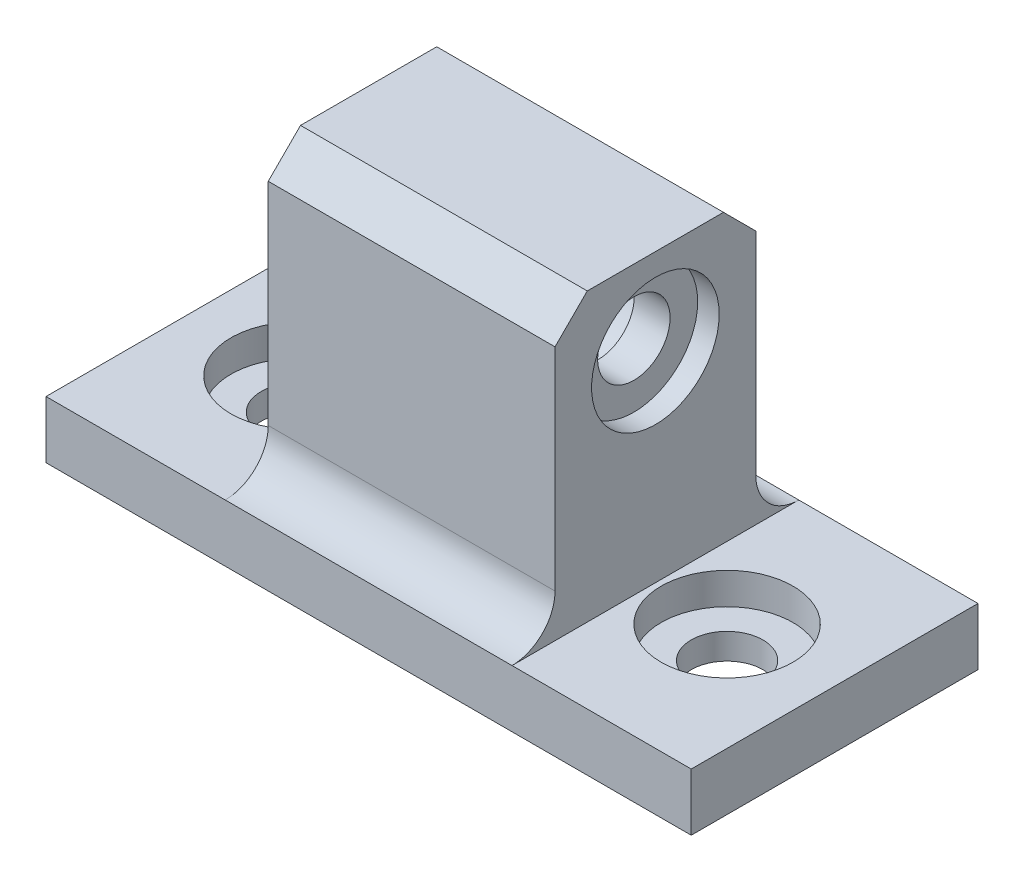
ISO-10303-21;
HEADER;
FILE_DESCRIPTION(('STEP AP214'),'2;1');
FILE_NAME('part.step','',(''),(''),'','','');
FILE_SCHEMA(('AUTOMOTIVE_DESIGN { 1 0 10303 214 1 1 1 1 }'));
ENDSEC;
DATA;
#1=APPLICATION_CONTEXT('core data for automotive mechanical design processes');
#2=APPLICATION_PROTOCOL_DEFINITION('international standard','automotive_design',2000,#1);
#3=PRODUCT_CONTEXT('',#1,'mechanical');
#4=PRODUCT('Part','Part','',(#3));
#5=PRODUCT_RELATED_PRODUCT_CATEGORY('part','',(#4));
#6=PRODUCT_DEFINITION_FORMATION('','',#4);
#7=PRODUCT_DEFINITION_CONTEXT('part definition',#1,'design');
#8=PRODUCT_DEFINITION('design','',#6,#7);
#9=PRODUCT_DEFINITION_SHAPE('','',#8);
#10=(LENGTH_UNIT() NAMED_UNIT(*) SI_UNIT(.MILLI.,.METRE.));
#11=(NAMED_UNIT(*) PLANE_ANGLE_UNIT() SI_UNIT($,.RADIAN.));
#12=(NAMED_UNIT(*) SI_UNIT($,.STERADIAN.) SOLID_ANGLE_UNIT());
#13=UNCERTAINTY_MEASURE_WITH_UNIT(LENGTH_MEASURE(1.E-05),#10,'distance_accuracy_value','');
#14=(GEOMETRIC_REPRESENTATION_CONTEXT(3) GLOBAL_UNCERTAINTY_ASSIGNED_CONTEXT((#13)) GLOBAL_UNIT_ASSIGNED_CONTEXT((#10,
#11,#12)) REPRESENTATION_CONTEXT('',''));
#15=CARTESIAN_POINT('',(0.,0.,0.));
#16=DIRECTION('',(0.,0.,1.));
#17=DIRECTION('',(1.,0.,0.));
#18=AXIS2_PLACEMENT_3D('',#15,#16,#17);
#19=CARTESIAN_POINT('',(0.,4.,0.));
#20=DIRECTION('',(0.,1.,0.));
#21=DIRECTION('',(0.,0.,1.));
#22=AXIS2_PLACEMENT_3D('',#19,#20,#21);
#23=PLANE('',#22);
#24=CARTESIAN_POINT('',(15.,4.,0.));
#25=DIRECTION('',(0.,1.,0.));
#26=DIRECTION('',(0.,0.,1.));
#27=AXIS2_PLACEMENT_3D('',#24,#25,#26);
#28=CIRCLE('',#27,4.6);
#29=CARTESIAN_POINT('',(15.,4.,4.6));
#30=VERTEX_POINT('',#29);
#31=EDGE_CURVE('E291',#30,#30,#28,.T.);
#32=ORIENTED_EDGE('',*,*,#31,.F.);
#33=EDGE_LOOP('',(#32));
#34=FACE_BOUND('',#33,.T.);
#35=DIRECTION('',(1.,0.,0.));
#36=VECTOR('',#35,1.);
#37=CARTESIAN_POINT('',(0.,4.,-10.));
#38=LINE('',#37,#36);
#39=CARTESIAN_POINT('',(10.,4.,-10.));
#40=VERTEX_POINT('',#39);
#41=CARTESIAN_POINT('',(22.5,4.,-10.));
#42=VERTEX_POINT('',#41);
#43=EDGE_CURVE('E158',#40,#42,#38,.T.);
#44=ORIENTED_EDGE('',*,*,#43,.F.);
#45=DIRECTION('',(0.,0.,-1.));
#46=VECTOR('',#45,1.);
#47=CARTESIAN_POINT('',(10.,4.,0.));
#48=LINE('',#47,#46);
#49=CARTESIAN_POINT('',(10.,4.,10.));
#50=VERTEX_POINT('',#49);
#51=EDGE_CURVE('E141',#50,#40,#48,.T.);
#52=ORIENTED_EDGE('',*,*,#51,.F.);
#53=DIRECTION('',(1.,0.,0.));
#54=VECTOR('',#53,1.);
#55=CARTESIAN_POINT('',(0.,4.,10.));
#56=LINE('',#55,#54);
#57=CARTESIAN_POINT('',(22.5,4.,10.));
#58=VERTEX_POINT('',#57);
#59=EDGE_CURVE('E136',#50,#58,#56,.T.);
#60=ORIENTED_EDGE('',*,*,#59,.T.);
#61=DIRECTION('',(0.,0.,-1.));
#62=VECTOR('',#61,1.);
#63=CARTESIAN_POINT('',(22.5,4.,0.));
#64=LINE('',#63,#62);
#65=EDGE_CURVE('E139',#58,#42,#64,.T.);
#66=ORIENTED_EDGE('',*,*,#65,.T.);
#67=EDGE_LOOP('',(#44,#52,#60,#66));
#68=FACE_BOUND('',#67,.T.);
#69=ADVANCED_FACE('F44',(#34,#68),#23,.T.);
#70=CARTESIAN_POINT('',(-1.14177848998413,18.,0.));
#71=DIRECTION('',(1.,0.,0.));
#72=DIRECTION('',(0.,0.,-1.));
#73=AXIS2_PLACEMENT_3D('',#70,#71,#72);
#74=CYLINDRICAL_SURFACE('',#73,2.525);
#75=CARTESIAN_POINT('',(6.,18.,0.));
#76=DIRECTION('',(-1.,0.,0.));
#77=DIRECTION('',(0.,0.,1.));
#78=AXIS2_PLACEMENT_3D('',#75,#76,#77);
#79=CIRCLE('',#78,2.525);
#80=CARTESIAN_POINT('',(6.,18.,2.525));
#81=VERTEX_POINT('',#80);
#82=EDGE_CURVE('E350',#81,#81,#79,.F.);
#83=ORIENTED_EDGE('',*,*,#82,.F.);
#84=EDGE_LOOP('',(#83));
#85=FACE_BOUND('',#84,.T.);
#86=CARTESIAN_POINT('',(8.5,18.,0.));
#87=DIRECTION('',(1.,0.,0.));
#88=DIRECTION('',(0.,0.,-1.));
#89=AXIS2_PLACEMENT_3D('',#86,#87,#88);
#90=CIRCLE('',#89,2.525);
#91=CARTESIAN_POINT('',(8.5,18.,-2.525));
#92=VERTEX_POINT('',#91);
#93=EDGE_CURVE('E358',#92,#92,#90,.T.);
#94=ORIENTED_EDGE('',*,*,#93,.T.);
#95=EDGE_LOOP('',(#94));
#96=FACE_BOUND('',#95,.T.);
#97=ADVANCED_FACE('F323',(#85,#96),#74,.F.);
#98=CARTESIAN_POINT('',(-15.,4.,0.));
#99=DIRECTION('',(0.,-1.,0.));
#100=DIRECTION('',(0.,0.,-1.));
#101=AXIS2_PLACEMENT_3D('',#98,#99,#100);
#102=CYLINDRICAL_SURFACE('',#101,2.5);
#103=CARTESIAN_POINT('',(-15.,0.,0.));
#104=DIRECTION('',(0.,1.,0.));
#105=DIRECTION('',(0.,0.,1.));
#106=AXIS2_PLACEMENT_3D('',#103,#104,#105);
#107=CIRCLE('',#106,2.5);
#108=CARTESIAN_POINT('',(-15.,0.,2.49999999999999));
#109=VERTEX_POINT('',#108);
#110=EDGE_CURVE('E251',#109,#109,#107,.F.);
#111=ORIENTED_EDGE('',*,*,#110,.T.);
#112=EDGE_LOOP('',(#111));
#113=FACE_BOUND('',#112,.T.);
#114=CARTESIAN_POINT('',(-15.,1.8,0.));
#115=DIRECTION('',(0.,1.,0.));
#116=DIRECTION('',(0.,0.,1.));
#117=AXIS2_PLACEMENT_3D('',#114,#115,#116);
#118=CIRCLE('',#117,2.5);
#119=CARTESIAN_POINT('',(-15.,1.8,2.49999999999999));
#120=VERTEX_POINT('',#119);
#121=EDGE_CURVE('E175',#120,#120,#118,.F.);
#122=ORIENTED_EDGE('',*,*,#121,.F.);
#123=EDGE_LOOP('',(#122));
#124=FACE_BOUND('',#123,.T.);
#125=ADVANCED_FACE('F277',(#113,#124),#102,.F.);
#126=CARTESIAN_POINT('',(15.,4.,0.));
#127=DIRECTION('',(0.,-1.,0.));
#128=DIRECTION('',(0.,0.,-1.));
#129=AXIS2_PLACEMENT_3D('',#126,#127,#128);
#130=CYLINDRICAL_SURFACE('',#129,2.5);
#131=CARTESIAN_POINT('',(15.,0.,0.));
#132=DIRECTION('',(0.,1.,0.));
#133=DIRECTION('',(0.,0.,1.));
#134=AXIS2_PLACEMENT_3D('',#131,#132,#133);
#135=CIRCLE('',#134,2.5);
#136=CARTESIAN_POINT('',(15.,0.,2.5));
#137=VERTEX_POINT('',#136);
#138=EDGE_CURVE('E148',#137,#137,#135,.T.);
#139=ORIENTED_EDGE('',*,*,#138,.F.);
#140=EDGE_LOOP('',(#139));
#141=FACE_BOUND('',#140,.T.);
#142=CARTESIAN_POINT('',(15.,1.8,0.));
#143=DIRECTION('',(0.,1.,0.));
#144=DIRECTION('',(0.,0.,1.));
#145=AXIS2_PLACEMENT_3D('',#142,#143,#144);
#146=CIRCLE('',#145,2.5);
#147=CARTESIAN_POINT('',(15.,1.8,2.5));
#148=VERTEX_POINT('',#147);
#149=EDGE_CURVE('E172',#148,#148,#146,.T.);
#150=ORIENTED_EDGE('',*,*,#149,.T.);
#151=EDGE_LOOP('',(#150));
#152=FACE_BOUND('',#151,.T.);
#153=ADVANCED_FACE('F274',(#141,#152),#130,.F.);
#154=CARTESIAN_POINT('',(0.,4.,10.));
#155=DIRECTION('',(0.,0.,-1.));
#156=DIRECTION('',(-1.,0.,0.));
#157=AXIS2_PLACEMENT_3D('',#154,#155,#156);
#158=PLANE('',#157);
#159=DIRECTION('',(1.,0.,0.));
#160=VECTOR('',#159,1.);
#161=CARTESIAN_POINT('',(0.,0.,10.));
#162=LINE('',#161,#160);
#163=CARTESIAN_POINT('',(-22.5,0.,10.));
#164=VERTEX_POINT('',#163);
#165=CARTESIAN_POINT('',(22.5,0.,10.));
#166=VERTEX_POINT('',#165);
#167=EDGE_CURVE('E162',#164,#166,#162,.T.);
#168=ORIENTED_EDGE('',*,*,#167,.T.);
#169=DIRECTION('',(0.,-1.,0.));
#170=VECTOR('',#169,1.);
#171=CARTESIAN_POINT('',(22.5,4.,10.));
#172=LINE('',#171,#170);
#173=EDGE_CURVE('E155',#58,#166,#172,.T.);
#174=ORIENTED_EDGE('',*,*,#173,.F.);
#175=ORIENTED_EDGE('',*,*,#59,.F.);
#176=CARTESIAN_POINT('',(-10.,4.,10.));
#177=VERTEX_POINT('',#176);
#178=EDGE_CURVE('E147',#177,#50,#56,.T.);
#179=ORIENTED_EDGE('',*,*,#178,.F.);
#180=CARTESIAN_POINT('',(-22.5,4.,10.));
#181=VERTEX_POINT('',#180);
#182=EDGE_CURVE('E150',#181,#177,#56,.T.);
#183=ORIENTED_EDGE('',*,*,#182,.F.);
#184=DIRECTION('',(0.,-1.,0.));
#185=VECTOR('',#184,1.);
#186=CARTESIAN_POINT('',(-22.5,4.,10.));
#187=LINE('',#186,#185);
#188=EDGE_CURVE('E241',#181,#164,#187,.T.);
#189=ORIENTED_EDGE('',*,*,#188,.T.);
#190=EDGE_LOOP('',(#168,#174,#175,#179,#183,#189));
#191=FACE_BOUND('',#190,.T.);
#192=ADVANCED_FACE('F160',(#191),#158,.F.);
#193=CARTESIAN_POINT('',(22.5,4.,0.));
#194=DIRECTION('',(-1.,0.,0.));
#195=DIRECTION('',(0.,0.,1.));
#196=AXIS2_PLACEMENT_3D('',#193,#194,#195);
#197=PLANE('',#196);
#198=DIRECTION('',(0.,0.,-1.));
#199=VECTOR('',#198,1.);
#200=CARTESIAN_POINT('',(22.5,0.,0.));
#201=LINE('',#200,#199);
#202=CARTESIAN_POINT('',(22.5,0.,-10.));
#203=VERTEX_POINT('',#202);
#204=EDGE_CURVE('E243',#166,#203,#201,.T.);
#205=ORIENTED_EDGE('',*,*,#204,.T.);
#206=DIRECTION('',(0.,-1.,0.));
#207=VECTOR('',#206,1.);
#208=CARTESIAN_POINT('',(22.5,4.,-10.));
#209=LINE('',#208,#207);
#210=EDGE_CURVE('E157',#42,#203,#209,.T.);
#211=ORIENTED_EDGE('',*,*,#210,.F.);
#212=ORIENTED_EDGE('',*,*,#65,.F.);
#213=ORIENTED_EDGE('',*,*,#173,.T.);
#214=EDGE_LOOP('',(#205,#211,#212,#213));
#215=FACE_BOUND('',#214,.T.);
#216=ADVANCED_FACE('F154',(#215),#197,.F.);
#217=CARTESIAN_POINT('',(0.,4.,-10.));
#218=DIRECTION('',(0.,0.,-1.));
#219=DIRECTION('',(-1.,0.,0.));
#220=AXIS2_PLACEMENT_3D('',#217,#218,#219);
#221=PLANE('',#220);
#222=DIRECTION('',(1.,0.,0.));
#223=VECTOR('',#222,1.);
#224=CARTESIAN_POINT('',(0.,0.,-10.));
#225=LINE('',#224,#223);
#226=CARTESIAN_POINT('',(-22.5,0.,-10.));
#227=VERTEX_POINT('',#226);
#228=EDGE_CURVE('E245',#227,#203,#225,.T.);
#229=ORIENTED_EDGE('',*,*,#228,.F.);
#230=DIRECTION('',(0.,-1.,0.));
#231=VECTOR('',#230,1.);
#232=CARTESIAN_POINT('',(-22.5,4.,-10.));
#233=LINE('',#232,#231);
#234=CARTESIAN_POINT('',(-22.5,4.,-10.));
#235=VERTEX_POINT('',#234);
#236=EDGE_CURVE('E168',#235,#227,#233,.T.);
#237=ORIENTED_EDGE('',*,*,#236,.F.);
#238=CARTESIAN_POINT('',(-10.,4.,-10.));
#239=VERTEX_POINT('',#238);
#240=EDGE_CURVE('E234',#235,#239,#38,.T.);
#241=ORIENTED_EDGE('',*,*,#240,.T.);
#242=EDGE_CURVE('E238',#239,#40,#38,.T.);
#243=ORIENTED_EDGE('',*,*,#242,.T.);
#244=ORIENTED_EDGE('',*,*,#43,.T.);
#245=ORIENTED_EDGE('',*,*,#210,.T.);
#246=EDGE_LOOP('',(#229,#237,#241,#243,#244,#245));
#247=FACE_BOUND('',#246,.T.);
#248=ADVANCED_FACE('F263',(#247),#221,.T.);
#249=CARTESIAN_POINT('',(-22.5,4.,0.));
#250=DIRECTION('',(-1.,0.,0.));
#251=DIRECTION('',(0.,0.,1.));
#252=AXIS2_PLACEMENT_3D('',#249,#250,#251);
#253=PLANE('',#252);
#254=DIRECTION('',(0.,0.,-1.));
#255=VECTOR('',#254,1.);
#256=CARTESIAN_POINT('',(-22.5,0.,0.));
#257=LINE('',#256,#255);
#258=EDGE_CURVE('E248',#164,#227,#257,.T.);
#259=ORIENTED_EDGE('',*,*,#258,.F.);
#260=ORIENTED_EDGE('',*,*,#188,.F.);
#261=DIRECTION('',(0.,0.,-1.));
#262=VECTOR('',#261,1.);
#263=CARTESIAN_POINT('',(-22.5,4.,0.));
#264=LINE('',#263,#262);
#265=EDGE_CURVE('E237',#181,#235,#264,.T.);
#266=ORIENTED_EDGE('',*,*,#265,.T.);
#267=ORIENTED_EDGE('',*,*,#236,.T.);
#268=EDGE_LOOP('',(#259,#260,#266,#267));
#269=FACE_BOUND('',#268,.T.);
#270=ADVANCED_FACE('F259',(#269),#253,.T.);
#271=CARTESIAN_POINT('',(-15.,4.,0.));
#272=DIRECTION('',(0.,1.,0.));
#273=DIRECTION('',(0.,0.,1.));
#274=AXIS2_PLACEMENT_3D('',#271,#272,#273);
#275=CIRCLE('',#274,4.6);
#276=CARTESIAN_POINT('',(-15.,4.,4.59999999999999));
#277=VERTEX_POINT('',#276);
#278=EDGE_CURVE('E295',#277,#277,#275,.T.);
#279=ORIENTED_EDGE('',*,*,#278,.F.);
#280=EDGE_LOOP('',(#279));
#281=FACE_BOUND('',#280,.T.);
#282=DIRECTION('',(0.,0.,-1.));
#283=VECTOR('',#282,1.);
#284=CARTESIAN_POINT('',(-10.,4.,0.));
#285=LINE('',#284,#283);
#286=EDGE_CURVE('E227',#177,#239,#285,.T.);
#287=ORIENTED_EDGE('',*,*,#286,.T.);
#288=ORIENTED_EDGE('',*,*,#240,.F.);
#289=ORIENTED_EDGE('',*,*,#265,.F.);
#290=ORIENTED_EDGE('',*,*,#182,.T.);
#291=EDGE_LOOP('',(#287,#288,#289,#290));
#292=FACE_BOUND('',#291,.T.);
#293=ADVANCED_FACE('F268',(#281,#292),#23,.T.);
#294=CARTESIAN_POINT('',(0.,0.,0.));
#295=DIRECTION('',(0.,1.,0.));
#296=DIRECTION('',(0.,0.,1.));
#297=AXIS2_PLACEMENT_3D('',#294,#295,#296);
#298=PLANE('',#297);
#299=ORIENTED_EDGE('',*,*,#167,.F.);
#300=ORIENTED_EDGE('',*,*,#258,.T.);
#301=ORIENTED_EDGE('',*,*,#228,.T.);
#302=ORIENTED_EDGE('',*,*,#204,.F.);
#303=EDGE_LOOP('',(#299,#300,#301,#302));
#304=FACE_BOUND('',#303,.T.);
#305=ORIENTED_EDGE('',*,*,#110,.F.);
#306=EDGE_LOOP('',(#305));
#307=FACE_BOUND('',#306,.T.);
#308=ORIENTED_EDGE('',*,*,#138,.T.);
#309=EDGE_LOOP('',(#308));
#310=FACE_BOUND('',#309,.T.);
#311=ADVANCED_FACE('F265',(#304,#307,#310),#298,.F.);
#312=CARTESIAN_POINT('',(10.,24.,0.));
#313=DIRECTION('',(-1.,0.,0.));
#314=DIRECTION('',(0.,0.,1.));
#315=AXIS2_PLACEMENT_3D('',#312,#313,#314);
#316=PLANE('',#315);
#317=CARTESIAN_POINT('',(10.,18.,0.));
#318=DIRECTION('',(1.,0.,0.));
#319=DIRECTION('',(0.,0.,-1.));
#320=AXIS2_PLACEMENT_3D('',#317,#318,#319);
#321=CIRCLE('',#320,4.45);
#322=CARTESIAN_POINT('',(10.,18.,-4.45));
#323=VERTEX_POINT('',#322);
#324=EDGE_CURVE('E355',#323,#323,#321,.T.);
#325=ORIENTED_EDGE('',*,*,#324,.F.);
#326=EDGE_LOOP('',(#325));
#327=FACE_BOUND('',#326,.T.);
#328=DIRECTION('',(0.,0.,-1.));
#329=VECTOR('',#328,1.);
#330=CARTESIAN_POINT('',(10.,24.,0.));
#331=LINE('',#330,#329);
#332=CARTESIAN_POINT('',(10.,24.,4.75000000000001));
#333=VERTEX_POINT('',#332);
#334=CARTESIAN_POINT('',(10.,24.,-4.75000000000001));
#335=VERTEX_POINT('',#334);
#336=EDGE_CURVE('E215',#333,#335,#331,.T.);
#337=ORIENTED_EDGE('',*,*,#336,.F.);
#338=DIRECTION('',(0.,0.707106781186549,-0.707106781186546));
#339=VECTOR('',#338,1.);
#340=CARTESIAN_POINT('',(10.,24.,4.75));
#341=LINE('',#340,#339);
#342=CARTESIAN_POINT('',(10.,21.75,7.));
#343=VERTEX_POINT('',#342);
#344=EDGE_CURVE('E199',#333,#343,#341,.F.);
#345=ORIENTED_EDGE('',*,*,#344,.T.);
#346=DIRECTION('',(0.,-1.,0.));
#347=VECTOR('',#346,1.);
#348=CARTESIAN_POINT('',(10.,24.,7.));
#349=LINE('',#348,#347);
#350=CARTESIAN_POINT('',(10.,7.,7.));
#351=VERTEX_POINT('',#350);
#352=EDGE_CURVE('E214',#343,#351,#349,.T.);
#353=ORIENTED_EDGE('',*,*,#352,.T.);
#354=CARTESIAN_POINT('',(10.,7.,10.));
#355=DIRECTION('',(-1.,0.,0.));
#356=DIRECTION('',(0.,0.,1.));
#357=AXIS2_PLACEMENT_3D('',#354,#355,#356);
#358=CIRCLE('',#357,3.);
#359=EDGE_CURVE('E187',#351,#50,#358,.T.);
#360=ORIENTED_EDGE('',*,*,#359,.T.);
#361=ORIENTED_EDGE('',*,*,#51,.T.);
#362=CARTESIAN_POINT('',(10.,7.,-10.));
#363=DIRECTION('',(-1.,0.,0.));
#364=DIRECTION('',(0.,0.,1.));
#365=AXIS2_PLACEMENT_3D('',#362,#363,#364);
#366=CIRCLE('',#365,3.);
#367=CARTESIAN_POINT('',(10.,7.,-7.));
#368=VERTEX_POINT('',#367);
#369=EDGE_CURVE('E181',#40,#368,#366,.T.);
#370=ORIENTED_EDGE('',*,*,#369,.T.);
#371=DIRECTION('',(0.,-1.,0.));
#372=VECTOR('',#371,1.);
#373=CARTESIAN_POINT('',(10.,24.,-7.));
#374=LINE('',#373,#372);
#375=CARTESIAN_POINT('',(10.,21.75,-7.));
#376=VERTEX_POINT('',#375);
#377=EDGE_CURVE('E231',#376,#368,#374,.T.);
#378=ORIENTED_EDGE('',*,*,#377,.F.);
#379=DIRECTION('',(0.,0.707106781186546,0.707106781186549));
#380=VECTOR('',#379,1.);
#381=CARTESIAN_POINT('',(10.,21.75,-7.));
#382=LINE('',#381,#380);
#383=EDGE_CURVE('E197',#376,#335,#382,.T.);
#384=ORIENTED_EDGE('',*,*,#383,.T.);
#385=EDGE_LOOP('',(#337,#345,#353,#360,#361,#370,#378,#384));
#386=FACE_BOUND('',#385,.T.);
#387=ADVANCED_FACE('F219',(#327,#386),#316,.F.);
#388=CARTESIAN_POINT('',(0.,24.,-7.));
#389=DIRECTION('',(0.,0.,-1.));
#390=DIRECTION('',(-1.,0.,0.));
#391=AXIS2_PLACEMENT_3D('',#388,#389,#390);
#392=PLANE('',#391);
#393=DIRECTION('',(0.,-1.,0.));
#394=VECTOR('',#393,1.);
#395=CARTESIAN_POINT('',(-10.,24.,-7.));
#396=LINE('',#395,#394);
#397=CARTESIAN_POINT('',(-10.,21.75,-7.));
#398=VERTEX_POINT('',#397);
#399=CARTESIAN_POINT('',(-10.,7.,-7.));
#400=VERTEX_POINT('',#399);
#401=EDGE_CURVE('E224',#398,#400,#396,.T.);
#402=ORIENTED_EDGE('',*,*,#401,.F.);
#403=DIRECTION('',(1.,0.,0.));
#404=VECTOR('',#403,1.);
#405=CARTESIAN_POINT('',(10.,21.75,-7.));
#406=LINE('',#405,#404);
#407=EDGE_CURVE('E11',#398,#376,#406,.T.);
#408=ORIENTED_EDGE('',*,*,#407,.T.);
#409=ORIENTED_EDGE('',*,*,#377,.T.);
#410=DIRECTION('',(1.,0.,0.));
#411=VECTOR('',#410,1.);
#412=CARTESIAN_POINT('',(-10.,7.,-7.));
#413=LINE('',#412,#411);
#414=EDGE_CURVE('E163',#368,#400,#413,.F.);
#415=ORIENTED_EDGE('',*,*,#414,.T.);
#416=EDGE_LOOP('',(#402,#408,#409,#415));
#417=FACE_BOUND('',#416,.T.);
#418=ADVANCED_FACE('F314',(#417),#392,.T.);
#419=CARTESIAN_POINT('',(-10.,24.,0.));
#420=DIRECTION('',(-1.,0.,0.));
#421=DIRECTION('',(0.,0.,1.));
#422=AXIS2_PLACEMENT_3D('',#419,#420,#421);
#423=PLANE('',#422);
#424=CARTESIAN_POINT('',(-10.,18.,0.));
#425=DIRECTION('',(-1.,0.,0.));
#426=DIRECTION('',(0.,0.,1.));
#427=AXIS2_PLACEMENT_3D('',#424,#425,#426);
#428=CIRCLE('',#427,4.6);
#429=CARTESIAN_POINT('',(-10.,18.,4.6));
#430=VERTEX_POINT('',#429);
#431=EDGE_CURVE('E298',#430,#430,#428,.T.);
#432=ORIENTED_EDGE('',*,*,#431,.F.);
#433=EDGE_LOOP('',(#432));
#434=FACE_BOUND('',#433,.T.);
#435=DIRECTION('',(0.,-1.,0.));
#436=VECTOR('',#435,1.);
#437=CARTESIAN_POINT('',(-10.,24.,6.99999999999999));
#438=LINE('',#437,#436);
#439=CARTESIAN_POINT('',(-10.,21.75,6.99999999999999));
#440=VERTEX_POINT('',#439);
#441=CARTESIAN_POINT('',(-10.,7.,6.99999999999999));
#442=VERTEX_POINT('',#441);
#443=EDGE_CURVE('E206',#440,#442,#438,.T.);
#444=ORIENTED_EDGE('',*,*,#443,.F.);
#445=DIRECTION('',(0.,-0.707106781186549,0.707106781186546));
#446=VECTOR('',#445,1.);
#447=CARTESIAN_POINT('',(-10.,26.375,2.375));
#448=LINE('',#447,#446);
#449=CARTESIAN_POINT('',(-10.,24.,4.74999999999999));
#450=VERTEX_POINT('',#449);
#451=EDGE_CURVE('E53',#440,#450,#448,.F.);
#452=ORIENTED_EDGE('',*,*,#451,.T.);
#453=DIRECTION('',(0.,0.,-1.));
#454=VECTOR('',#453,1.);
#455=CARTESIAN_POINT('',(-10.,24.,0.));
#456=LINE('',#455,#454);
#457=CARTESIAN_POINT('',(-10.,24.,-4.75000000000001));
#458=VERTEX_POINT('',#457);
#459=EDGE_CURVE('E205',#450,#458,#456,.T.);
#460=ORIENTED_EDGE('',*,*,#459,.T.);
#461=DIRECTION('',(0.,-0.707106781186546,-0.707106781186549));
#462=VECTOR('',#461,1.);
#463=CARTESIAN_POINT('',(-10.,26.375,-2.375));
#464=LINE('',#463,#462);
#465=EDGE_CURVE('E60',#458,#398,#464,.T.);
#466=ORIENTED_EDGE('',*,*,#465,.T.);
#467=ORIENTED_EDGE('',*,*,#401,.T.);
#468=CARTESIAN_POINT('',(-10.,7.,-10.));
#469=DIRECTION('',(-1.,0.,0.));
#470=DIRECTION('',(0.,0.,1.));
#471=AXIS2_PLACEMENT_3D('',#468,#469,#470);
#472=CIRCLE('',#471,3.);
#473=EDGE_CURVE('E184',#400,#239,#472,.F.);
#474=ORIENTED_EDGE('',*,*,#473,.T.);
#475=ORIENTED_EDGE('',*,*,#286,.F.);
#476=CARTESIAN_POINT('',(-10.,7.,9.99999999999999));
#477=DIRECTION('',(-1.,0.,0.));
#478=DIRECTION('',(0.,0.,1.));
#479=AXIS2_PLACEMENT_3D('',#476,#477,#478);
#480=CIRCLE('',#479,3.);
#481=EDGE_CURVE('E189',#177,#442,#480,.F.);
#482=ORIENTED_EDGE('',*,*,#481,.T.);
#483=EDGE_LOOP('',(#444,#452,#460,#466,#467,#474,#475,#482));
#484=FACE_BOUND('',#483,.T.);
#485=ADVANCED_FACE('F204',(#434,#484),#423,.T.);
#486=CARTESIAN_POINT('',(0.,24.,6.99999999999999));
#487=DIRECTION('',(0.,0.,-1.));
#488=DIRECTION('',(-1.,0.,0.));
#489=AXIS2_PLACEMENT_3D('',#486,#487,#488);
#490=PLANE('',#489);
#491=ORIENTED_EDGE('',*,*,#352,.F.);
#492=DIRECTION('',(-1.,0.,0.));
#493=VECTOR('',#492,1.);
#494=CARTESIAN_POINT('',(0.,21.75,6.99999999999999));
#495=LINE('',#494,#493);
#496=EDGE_CURVE('E68',#343,#440,#495,.T.);
#497=ORIENTED_EDGE('',*,*,#496,.T.);
#498=ORIENTED_EDGE('',*,*,#443,.T.);
#499=DIRECTION('',(1.,0.,0.));
#500=VECTOR('',#499,1.);
#501=CARTESIAN_POINT('',(0.,7.,6.99999999999999));
#502=LINE('',#501,#500);
#503=EDGE_CURVE('E166',#442,#351,#502,.T.);
#504=ORIENTED_EDGE('',*,*,#503,.T.);
#505=EDGE_LOOP('',(#491,#497,#498,#504));
#506=FACE_BOUND('',#505,.T.);
#507=ADVANCED_FACE('F221',(#506),#490,.F.);
#508=CARTESIAN_POINT('',(0.,24.,0.));
#509=DIRECTION('',(0.,-1.,0.));
#510=DIRECTION('',(0.,0.,-1.));
#511=AXIS2_PLACEMENT_3D('',#508,#509,#510);
#512=PLANE('',#511);
#513=ORIENTED_EDGE('',*,*,#459,.F.);
#514=DIRECTION('',(1.,0.,0.));
#515=VECTOR('',#514,1.);
#516=CARTESIAN_POINT('',(0.,24.,4.75));
#517=LINE('',#516,#515);
#518=EDGE_CURVE('E194',#450,#333,#517,.T.);
#519=ORIENTED_EDGE('',*,*,#518,.T.);
#520=ORIENTED_EDGE('',*,*,#336,.T.);
#521=DIRECTION('',(-1.,0.,0.));
#522=VECTOR('',#521,1.);
#523=CARTESIAN_POINT('',(-10.,24.,-4.75000000000001));
#524=LINE('',#523,#522);
#525=EDGE_CURVE('E192',#335,#458,#524,.T.);
#526=ORIENTED_EDGE('',*,*,#525,.T.);
#527=EDGE_LOOP('',(#513,#519,#520,#526));
#528=FACE_BOUND('',#527,.T.);
#529=ADVANCED_FACE('F210',(#528),#512,.F.);
#530=CARTESIAN_POINT('',(15.,1.8,0.));
#531=DIRECTION('',(0.,1.,0.));
#532=DIRECTION('',(0.,0.,1.));
#533=AXIS2_PLACEMENT_3D('',#530,#531,#532);
#534=CYLINDRICAL_SURFACE('',#533,4.6);
#535=CARTESIAN_POINT('',(15.,1.8,0.));
#536=DIRECTION('',(0.,1.,0.));
#537=DIRECTION('',(0.,0.,1.));
#538=AXIS2_PLACEMENT_3D('',#535,#536,#537);
#539=CIRCLE('',#538,4.6);
#540=CARTESIAN_POINT('',(15.,1.8,4.6));
#541=VERTEX_POINT('',#540);
#542=EDGE_CURVE('E289',#541,#541,#539,.T.);
#543=ORIENTED_EDGE('',*,*,#542,.F.);
#544=EDGE_LOOP('',(#543));
#545=FACE_BOUND('',#544,.T.);
#546=ORIENTED_EDGE('',*,*,#31,.T.);
#547=EDGE_LOOP('',(#546));
#548=FACE_BOUND('',#547,.T.);
#549=ADVANCED_FACE('F285',(#545,#548),#534,.F.);
#550=CARTESIAN_POINT('',(15.,1.8,0.));
#551=DIRECTION('',(0.,1.,0.));
#552=DIRECTION('',(0.,0.,1.));
#553=AXIS2_PLACEMENT_3D('',#550,#551,#552);
#554=PLANE('',#553);
#555=ORIENTED_EDGE('',*,*,#149,.F.);
#556=EDGE_LOOP('',(#555));
#557=FACE_BOUND('',#556,.T.);
#558=ORIENTED_EDGE('',*,*,#542,.T.);
#559=EDGE_LOOP('',(#558));
#560=FACE_BOUND('',#559,.T.);
#561=ADVANCED_FACE('F281',(#557,#560),#554,.T.);
#562=CARTESIAN_POINT('',(-15.,1.8,0.));
#563=DIRECTION('',(0.,1.,0.));
#564=DIRECTION('',(0.,0.,1.));
#565=AXIS2_PLACEMENT_3D('',#562,#563,#564);
#566=PLANE('',#565);
#567=CARTESIAN_POINT('',(-15.,1.8,0.));
#568=DIRECTION('',(0.,1.,0.));
#569=DIRECTION('',(0.,0.,1.));
#570=AXIS2_PLACEMENT_3D('',#567,#568,#569);
#571=CIRCLE('',#570,4.6);
#572=CARTESIAN_POINT('',(-15.,1.8,4.59999999999999));
#573=VERTEX_POINT('',#572);
#574=EDGE_CURVE('E176',#573,#573,#571,.T.);
#575=ORIENTED_EDGE('',*,*,#574,.T.);
#576=EDGE_LOOP('',(#575));
#577=FACE_BOUND('',#576,.T.);
#578=ORIENTED_EDGE('',*,*,#121,.T.);
#579=EDGE_LOOP('',(#578));
#580=FACE_BOUND('',#579,.T.);
#581=ADVANCED_FACE('F284',(#577,#580),#566,.T.);
#582=CARTESIAN_POINT('',(-15.,1.8,0.));
#583=DIRECTION('',(0.,1.,0.));
#584=DIRECTION('',(0.,0.,1.));
#585=AXIS2_PLACEMENT_3D('',#582,#583,#584);
#586=CYLINDRICAL_SURFACE('',#585,4.6);
#587=ORIENTED_EDGE('',*,*,#574,.F.);
#588=EDGE_LOOP('',(#587));
#589=FACE_BOUND('',#588,.T.);
#590=ORIENTED_EDGE('',*,*,#278,.T.);
#591=EDGE_LOOP('',(#590));
#592=FACE_BOUND('',#591,.T.);
#593=ADVANCED_FACE('F393',(#589,#592),#586,.F.);
#594=CARTESIAN_POINT('',(6.,18.,0.));
#595=DIRECTION('',(-1.,0.,0.));
#596=DIRECTION('',(0.,0.,1.));
#597=AXIS2_PLACEMENT_3D('',#594,#595,#596);
#598=CYLINDRICAL_SURFACE('',#597,4.6);
#599=CARTESIAN_POINT('',(6.,18.,0.));
#600=DIRECTION('',(-1.,0.,0.));
#601=DIRECTION('',(0.,0.,1.));
#602=AXIS2_PLACEMENT_3D('',#599,#600,#601);
#603=CIRCLE('',#602,4.6);
#604=CARTESIAN_POINT('',(6.,18.,4.6));
#605=VERTEX_POINT('',#604);
#606=EDGE_CURVE('E292',#605,#605,#603,.T.);
#607=ORIENTED_EDGE('',*,*,#606,.F.);
#608=EDGE_LOOP('',(#607));
#609=FACE_BOUND('',#608,.T.);
#610=ORIENTED_EDGE('',*,*,#431,.T.);
#611=EDGE_LOOP('',(#610));
#612=FACE_BOUND('',#611,.T.);
#613=ADVANCED_FACE('F396',(#609,#612),#598,.F.);
#614=CARTESIAN_POINT('',(6.,18.,0.));
#615=DIRECTION('',(-1.,0.,0.));
#616=DIRECTION('',(0.,0.,1.));
#617=AXIS2_PLACEMENT_3D('',#614,#615,#616);
#618=PLANE('',#617);
#619=ORIENTED_EDGE('',*,*,#82,.T.);
#620=EDGE_LOOP('',(#619));
#621=FACE_BOUND('',#620,.T.);
#622=ORIENTED_EDGE('',*,*,#606,.T.);
#623=EDGE_LOOP('',(#622));
#624=FACE_BOUND('',#623,.T.);
#625=ADVANCED_FACE('F373',(#621,#624),#618,.T.);
#626=CARTESIAN_POINT('',(8.5,18.,0.));
#627=DIRECTION('',(1.,0.,0.));
#628=DIRECTION('',(0.,0.,-1.));
#629=AXIS2_PLACEMENT_3D('',#626,#627,#628);
#630=CYLINDRICAL_SURFACE('',#629,4.45);
#631=CARTESIAN_POINT('',(8.5,18.,0.));
#632=DIRECTION('',(1.,0.,0.));
#633=DIRECTION('',(0.,0.,-1.));
#634=AXIS2_PLACEMENT_3D('',#631,#632,#633);
#635=CIRCLE('',#634,4.45);
#636=CARTESIAN_POINT('',(8.5,18.,-4.45));
#637=VERTEX_POINT('',#636);
#638=EDGE_CURVE('E354',#637,#637,#635,.T.);
#639=ORIENTED_EDGE('',*,*,#638,.F.);
#640=EDGE_LOOP('',(#639));
#641=FACE_BOUND('',#640,.T.);
#642=ORIENTED_EDGE('',*,*,#324,.T.);
#643=EDGE_LOOP('',(#642));
#644=FACE_BOUND('',#643,.T.);
#645=ADVANCED_FACE('F367',(#641,#644),#630,.F.);
#646=CARTESIAN_POINT('',(8.5,0.,0.));
#647=DIRECTION('',(1.,0.,0.));
#648=DIRECTION('',(0.,0.,-1.));
#649=AXIS2_PLACEMENT_3D('',#646,#647,#648);
#650=PLANE('',#649);
#651=ORIENTED_EDGE('',*,*,#93,.F.);
#652=EDGE_LOOP('',(#651));
#653=FACE_BOUND('',#652,.T.);
#654=ORIENTED_EDGE('',*,*,#638,.T.);
#655=EDGE_LOOP('',(#654));
#656=FACE_BOUND('',#655,.T.);
#657=ADVANCED_FACE('F365',(#653,#656),#650,.T.);
#658=CARTESIAN_POINT('',(0.,7.,-10.));
#659=DIRECTION('',(-1.,0.,0.));
#660=DIRECTION('',(0.,0.,1.));
#661=AXIS2_PLACEMENT_3D('',#658,#659,#660);
#662=CYLINDRICAL_SURFACE('',#661,3.);
#663=ORIENTED_EDGE('',*,*,#473,.F.);
#664=ORIENTED_EDGE('',*,*,#414,.F.);
#665=ORIENTED_EDGE('',*,*,#369,.F.);
#666=ORIENTED_EDGE('',*,*,#242,.F.);
#667=EDGE_LOOP('',(#663,#664,#665,#666));
#668=FACE_BOUND('',#667,.T.);
#669=ADVANCED_FACE('F311',(#668),#662,.F.);
#670=CARTESIAN_POINT('',(0.,7.,9.99999999999999));
#671=DIRECTION('',(1.,0.,0.));
#672=DIRECTION('',(0.,0.,-1.));
#673=AXIS2_PLACEMENT_3D('',#670,#671,#672);
#674=CYLINDRICAL_SURFACE('',#673,3.);
#675=ORIENTED_EDGE('',*,*,#481,.F.);
#676=ORIENTED_EDGE('',*,*,#178,.T.);
#677=ORIENTED_EDGE('',*,*,#359,.F.);
#678=ORIENTED_EDGE('',*,*,#503,.F.);
#679=EDGE_LOOP('',(#675,#676,#677,#678));
#680=FACE_BOUND('',#679,.T.);
#681=ADVANCED_FACE('F321',(#680),#674,.F.);
#682=CARTESIAN_POINT('',(0.,24.,4.75));
#683=DIRECTION('',(0.,-0.707106781186546,-0.707106781186549));
#684=DIRECTION('',(1.,0.,0.));
#685=AXIS2_PLACEMENT_3D('',#682,#683,#684);
#686=PLANE('',#685);
#687=ORIENTED_EDGE('',*,*,#451,.F.);
#688=ORIENTED_EDGE('',*,*,#496,.F.);
#689=ORIENTED_EDGE('',*,*,#344,.F.);
#690=ORIENTED_EDGE('',*,*,#518,.F.);
#691=EDGE_LOOP('',(#687,#688,#689,#690));
#692=FACE_BOUND('',#691,.T.);
#693=ADVANCED_FACE('F217',(#692),#686,.F.);
#694=CARTESIAN_POINT('',(0.,21.75,-7.));
#695=DIRECTION('',(0.,0.707106781186549,-0.707106781186546));
#696=DIRECTION('',(-1.,0.,0.));
#697=AXIS2_PLACEMENT_3D('',#694,#695,#696);
#698=PLANE('',#697);
#699=ORIENTED_EDGE('',*,*,#465,.F.);
#700=ORIENTED_EDGE('',*,*,#525,.F.);
#701=ORIENTED_EDGE('',*,*,#383,.F.);
#702=ORIENTED_EDGE('',*,*,#407,.F.);
#703=EDGE_LOOP('',(#699,#700,#701,#702));
#704=FACE_BOUND('',#703,.T.);
#705=ADVANCED_FACE('F47',(#704),#698,.T.);
#706=CLOSED_SHELL('',(#69,#97,#125,#153,#192,#216,#248,#270,#293,#311,#387,#418,#485,#507,#529,
#549,#561,#581,#593,#613,#625,#645,#657,#669,#681,#693,#705));
#707=MANIFOLD_SOLID_BREP('B2',#706);
#708=ADVANCED_BREP_SHAPE_REPRESENTATION('',(#18,#707),#14);
#709=SHAPE_DEFINITION_REPRESENTATION(#9,#708);
ENDSEC;
END-ISO-10303-21;
